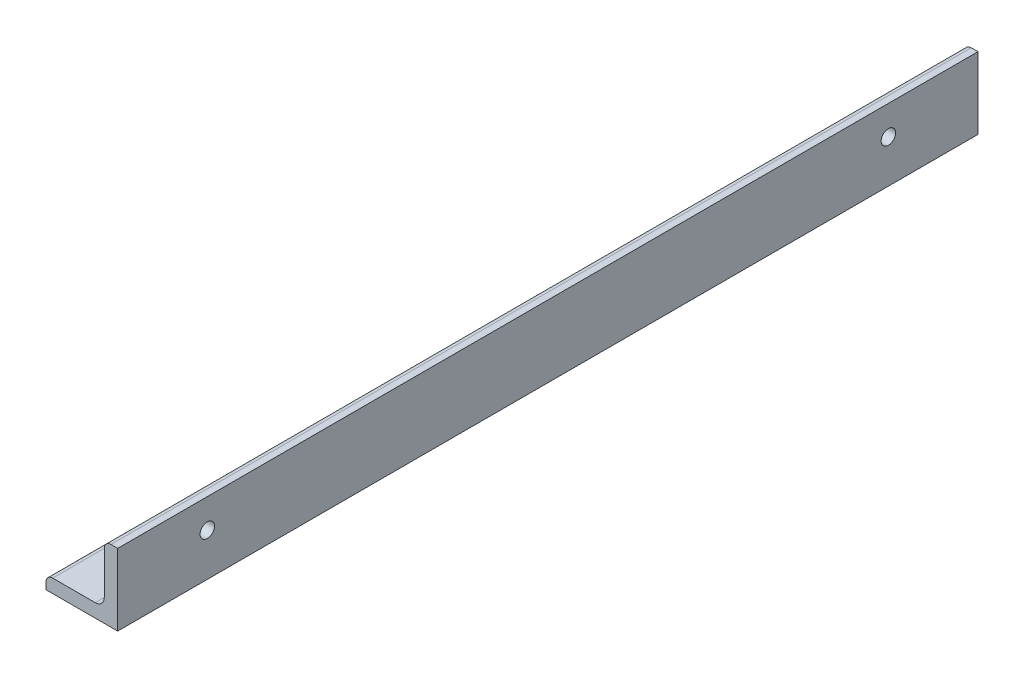
ISO-10303-21;
HEADER;
FILE_DESCRIPTION(('STEP AP214'),'2;1');
FILE_NAME('part.step','',(''),(''),'','','');
FILE_SCHEMA(('AUTOMOTIVE_DESIGN { 1 0 10303 214 1 1 1 1 }'));
ENDSEC;
DATA;
#1=APPLICATION_CONTEXT('core data for automotive mechanical design processes');
#2=APPLICATION_PROTOCOL_DEFINITION('international standard','automotive_design',2000,#1);
#3=PRODUCT_CONTEXT('',#1,'mechanical');
#4=PRODUCT('Part','Part','',(#3));
#5=PRODUCT_RELATED_PRODUCT_CATEGORY('part','',(#4));
#6=PRODUCT_DEFINITION_FORMATION('','',#4);
#7=PRODUCT_DEFINITION_CONTEXT('part definition',#1,'design');
#8=PRODUCT_DEFINITION('design','',#6,#7);
#9=PRODUCT_DEFINITION_SHAPE('','',#8);
#10=(LENGTH_UNIT() NAMED_UNIT(*) SI_UNIT(.MILLI.,.METRE.));
#11=(NAMED_UNIT(*) PLANE_ANGLE_UNIT() SI_UNIT($,.RADIAN.));
#12=(NAMED_UNIT(*) SI_UNIT($,.STERADIAN.) SOLID_ANGLE_UNIT());
#13=UNCERTAINTY_MEASURE_WITH_UNIT(LENGTH_MEASURE(1.E-05),#10,'distance_accuracy_value','');
#14=(GEOMETRIC_REPRESENTATION_CONTEXT(3) GLOBAL_UNCERTAINTY_ASSIGNED_CONTEXT((#13)) GLOBAL_UNIT_ASSIGNED_CONTEXT((#10,
#11,#12)) REPRESENTATION_CONTEXT('',''));
#15=CARTESIAN_POINT('',(0.,0.,0.));
#16=DIRECTION('',(0.,0.,1.));
#17=DIRECTION('',(1.,0.,0.));
#18=AXIS2_PLACEMENT_3D('',#15,#16,#17);
#19=CARTESIAN_POINT('',(-12.7,2.38125,152.4));
#20=DIRECTION('',(1.,0.,0.));
#21=DIRECTION('',(0.,0.,-1.));
#22=AXIS2_PLACEMENT_3D('',#19,#20,#21);
#23=PLANE('',#22);
#24=DIRECTION('',(0.,-1.,0.));
#25=VECTOR('',#24,1.);
#26=CARTESIAN_POINT('',(-12.7,2.38125,-152.4));
#27=LINE('',#26,#25);
#28=CARTESIAN_POINT('',(-12.7,2.38125,-152.4));
#29=VERTEX_POINT('',#28);
#30=CARTESIAN_POINT('',(-12.7,0.,-152.4));
#31=VERTEX_POINT('',#30);
#32=EDGE_CURVE('E148',#29,#31,#27,.T.);
#33=ORIENTED_EDGE('',*,*,#32,.T.);
#34=DIRECTION('',(0.,0.,-1.));
#35=VECTOR('',#34,1.);
#36=CARTESIAN_POINT('',(-12.7,0.,152.4));
#37=LINE('',#36,#35);
#38=CARTESIAN_POINT('',(-12.7,0.,152.4));
#39=VERTEX_POINT('',#38);
#40=EDGE_CURVE('E11',#39,#31,#37,.T.);
#41=ORIENTED_EDGE('',*,*,#40,.F.);
#42=DIRECTION('',(0.,-1.,0.));
#43=VECTOR('',#42,1.);
#44=CARTESIAN_POINT('',(-12.7,2.38125,152.4));
#45=LINE('',#44,#43);
#46=CARTESIAN_POINT('',(-12.7,2.38125,152.4));
#47=VERTEX_POINT('',#46);
#48=EDGE_CURVE('E174',#47,#39,#45,.T.);
#49=ORIENTED_EDGE('',*,*,#48,.F.);
#50=DIRECTION('',(0.,0.,-1.));
#51=VECTOR('',#50,1.);
#52=CARTESIAN_POINT('',(-12.7,2.38125,152.4));
#53=LINE('',#52,#51);
#54=EDGE_CURVE('E144',#47,#29,#53,.T.);
#55=ORIENTED_EDGE('',*,*,#54,.T.);
#56=EDGE_LOOP('',(#33,#41,#49,#55));
#57=FACE_BOUND('',#56,.T.);
#58=ADVANCED_FACE('F39',(#57),#23,.F.);
#59=CARTESIAN_POINT('',(-12.7,0.,152.4));
#60=DIRECTION('',(0.,1.,0.));
#61=DIRECTION('',(0.,0.,1.));
#62=AXIS2_PLACEMENT_3D('',#59,#60,#61);
#63=PLANE('',#62);
#64=CARTESIAN_POINT('',(-2.413,0.,120.65));
#65=DIRECTION('',(0.,-1.,0.));
#66=DIRECTION('',(0.,0.,-1.));
#67=AXIS2_PLACEMENT_3D('',#64,#65,#66);
#68=CIRCLE('',#67,2.55269999999999);
#69=CARTESIAN_POINT('',(-2.413,0.,118.0973));
#70=VERTEX_POINT('',#69);
#71=EDGE_CURVE('E397',#70,#70,#68,.T.);
#72=ORIENTED_EDGE('',*,*,#71,.F.);
#73=EDGE_LOOP('',(#72));
#74=FACE_BOUND('',#73,.T.);
#75=CARTESIAN_POINT('',(-2.413,0.,-120.65));
#76=DIRECTION('',(0.,-1.,0.));
#77=DIRECTION('',(0.,0.,-1.));
#78=AXIS2_PLACEMENT_3D('',#75,#76,#77);
#79=CIRCLE('',#78,2.55269999999999);
#80=CARTESIAN_POINT('',(-2.413,0.,-123.2027));
#81=VERTEX_POINT('',#80);
#82=EDGE_CURVE('E388',#81,#81,#79,.T.);
#83=ORIENTED_EDGE('',*,*,#82,.F.);
#84=EDGE_LOOP('',(#83));
#85=FACE_BOUND('',#84,.T.);
#86=DIRECTION('',(1.,0.,0.));
#87=VECTOR('',#86,1.);
#88=CARTESIAN_POINT('',(-12.7,0.,-152.4));
#89=LINE('',#88,#87);
#90=CARTESIAN_POINT('',(12.7,0.,-152.4));
#91=VERTEX_POINT('',#90);
#92=EDGE_CURVE('E152',#31,#91,#89,.T.);
#93=ORIENTED_EDGE('',*,*,#92,.T.);
#94=DIRECTION('',(0.,0.,-1.));
#95=VECTOR('',#94,1.);
#96=CARTESIAN_POINT('',(12.7,0.,152.4));
#97=LINE('',#96,#95);
#98=CARTESIAN_POINT('',(12.7,0.,152.4));
#99=VERTEX_POINT('',#98);
#100=EDGE_CURVE('E49',#99,#91,#97,.T.);
#101=ORIENTED_EDGE('',*,*,#100,.F.);
#102=DIRECTION('',(1.,0.,0.));
#103=VECTOR('',#102,1.);
#104=CARTESIAN_POINT('',(-12.7,0.,152.4));
#105=LINE('',#104,#103);
#106=EDGE_CURVE('E104',#39,#99,#105,.T.);
#107=ORIENTED_EDGE('',*,*,#106,.F.);
#108=ORIENTED_EDGE('',*,*,#40,.T.);
#109=EDGE_LOOP('',(#93,#101,#107,#108));
#110=FACE_BOUND('',#109,.T.);
#111=ADVANCED_FACE('F254',(#74,#85,#110),#63,.F.);
#112=CARTESIAN_POINT('',(12.7,0.,152.4));
#113=DIRECTION('',(-1.,0.,0.));
#114=DIRECTION('',(0.,0.,1.));
#115=AXIS2_PLACEMENT_3D('',#112,#113,#114);
#116=PLANE('',#115);
#117=CARTESIAN_POINT('',(12.7,15.113,120.65));
#118=DIRECTION('',(1.,0.,0.));
#119=DIRECTION('',(0.,0.,-1.));
#120=AXIS2_PLACEMENT_3D('',#117,#118,#119);
#121=CIRCLE('',#120,2.55269999999999);
#122=CARTESIAN_POINT('',(12.7,15.113,118.0973));
#123=VERTEX_POINT('',#122);
#124=EDGE_CURVE('E208',#123,#123,#121,.T.);
#125=ORIENTED_EDGE('',*,*,#124,.F.);
#126=EDGE_LOOP('',(#125));
#127=FACE_BOUND('',#126,.T.);
#128=CARTESIAN_POINT('',(12.7,15.113,-120.65));
#129=DIRECTION('',(1.,0.,0.));
#130=DIRECTION('',(0.,0.,-1.));
#131=AXIS2_PLACEMENT_3D('',#128,#129,#130);
#132=CIRCLE('',#131,2.55269999999999);
#133=CARTESIAN_POINT('',(12.7,15.113,-123.2027));
#134=VERTEX_POINT('',#133);
#135=EDGE_CURVE('E197',#134,#134,#132,.T.);
#136=ORIENTED_EDGE('',*,*,#135,.F.);
#137=EDGE_LOOP('',(#136));
#138=FACE_BOUND('',#137,.T.);
#139=DIRECTION('',(0.,1.,0.));
#140=VECTOR('',#139,1.);
#141=CARTESIAN_POINT('',(12.7,0.,-152.4));
#142=LINE('',#141,#140);
#143=CARTESIAN_POINT('',(12.7,25.4,-152.4));
#144=VERTEX_POINT('',#143);
#145=EDGE_CURVE('E156',#91,#144,#142,.T.);
#146=ORIENTED_EDGE('',*,*,#145,.T.);
#147=DIRECTION('',(0.,0.,-1.));
#148=VECTOR('',#147,1.);
#149=CARTESIAN_POINT('',(12.7,25.4,152.4));
#150=LINE('',#149,#148);
#151=CARTESIAN_POINT('',(12.7,25.4,152.4));
#152=VERTEX_POINT('',#151);
#153=EDGE_CURVE('E189',#152,#144,#150,.T.);
#154=ORIENTED_EDGE('',*,*,#153,.F.);
#155=DIRECTION('',(0.,1.,0.));
#156=VECTOR('',#155,1.);
#157=CARTESIAN_POINT('',(12.7,0.,152.4));
#158=LINE('',#157,#156);
#159=EDGE_CURVE('E216',#99,#152,#158,.T.);
#160=ORIENTED_EDGE('',*,*,#159,.F.);
#161=ORIENTED_EDGE('',*,*,#100,.T.);
#162=EDGE_LOOP('',(#146,#154,#160,#161));
#163=FACE_BOUND('',#162,.T.);
#164=ADVANCED_FACE('F258',(#127,#138,#163),#116,.F.);
#165=CARTESIAN_POINT('',(10.31875,25.4,152.4));
#166=DIRECTION('',(0.,-1.,0.));
#167=DIRECTION('',(0.,0.,-1.));
#168=AXIS2_PLACEMENT_3D('',#165,#166,#167);
#169=PLANE('',#168);
#170=DIRECTION('',(-1.,0.,0.));
#171=VECTOR('',#170,1.);
#172=CARTESIAN_POINT('',(10.31875,25.4,-152.4));
#173=LINE('',#172,#171);
#174=CARTESIAN_POINT('',(10.31875,25.4,-152.4));
#175=VERTEX_POINT('',#174);
#176=EDGE_CURVE('E159',#144,#175,#173,.T.);
#177=ORIENTED_EDGE('',*,*,#176,.T.);
#178=DIRECTION('',(0.,0.,-1.));
#179=VECTOR('',#178,1.);
#180=CARTESIAN_POINT('',(10.31875,25.4,152.4));
#181=LINE('',#180,#179);
#182=CARTESIAN_POINT('',(10.31875,25.4,152.4));
#183=VERTEX_POINT('',#182);
#184=EDGE_CURVE('E185',#183,#175,#181,.T.);
#185=ORIENTED_EDGE('',*,*,#184,.F.);
#186=DIRECTION('',(-1.,0.,0.));
#187=VECTOR('',#186,1.);
#188=CARTESIAN_POINT('',(10.31875,25.4,152.4));
#189=LINE('',#188,#187);
#190=EDGE_CURVE('E219',#152,#183,#189,.T.);
#191=ORIENTED_EDGE('',*,*,#190,.F.);
#192=ORIENTED_EDGE('',*,*,#153,.T.);
#193=EDGE_LOOP('',(#177,#185,#191,#192));
#194=FACE_BOUND('',#193,.T.);
#195=ADVANCED_FACE('F263',(#194),#169,.F.);
#196=CARTESIAN_POINT('',(10.31875,23.01875,152.4));
#197=DIRECTION('',(0.,0.,-1.));
#198=DIRECTION('',(-1.,0.,0.));
#199=AXIS2_PLACEMENT_3D('',#196,#197,#198);
#200=CYLINDRICAL_SURFACE('',#199,2.38125);
#201=CARTESIAN_POINT('',(10.31875,23.01875,-152.4));
#202=DIRECTION('',(0.,0.,1.));
#203=DIRECTION('',(-1.,0.,0.));
#204=AXIS2_PLACEMENT_3D('',#201,#202,#203);
#205=CIRCLE('',#204,2.38125);
#206=CARTESIAN_POINT('',(7.9375,23.01875,-152.4));
#207=VERTEX_POINT('',#206);
#208=EDGE_CURVE('E162',#175,#207,#205,.T.);
#209=ORIENTED_EDGE('',*,*,#208,.T.);
#210=DIRECTION('',(0.,0.,-1.));
#211=VECTOR('',#210,1.);
#212=CARTESIAN_POINT('',(7.9375,23.01875,152.4));
#213=LINE('',#212,#211);
#214=CARTESIAN_POINT('',(7.9375,23.01875,152.4));
#215=VERTEX_POINT('',#214);
#216=EDGE_CURVE('E181',#215,#207,#213,.T.);
#217=ORIENTED_EDGE('',*,*,#216,.F.);
#218=CARTESIAN_POINT('',(10.31875,23.01875,152.4));
#219=DIRECTION('',(0.,0.,1.));
#220=DIRECTION('',(-1.,0.,0.));
#221=AXIS2_PLACEMENT_3D('',#218,#219,#220);
#222=CIRCLE('',#221,2.38125);
#223=EDGE_CURVE('E222',#183,#215,#222,.T.);
#224=ORIENTED_EDGE('',*,*,#223,.F.);
#225=ORIENTED_EDGE('',*,*,#184,.T.);
#226=EDGE_LOOP('',(#209,#217,#224,#225));
#227=FACE_BOUND('',#226,.T.);
#228=ADVANCED_FACE('F230',(#227),#200,.T.);
#229=CARTESIAN_POINT('',(7.9375,23.01875,152.4));
#230=DIRECTION('',(1.,0.,0.));
#231=DIRECTION('',(0.,0.,-1.));
#232=AXIS2_PLACEMENT_3D('',#229,#230,#231);
#233=PLANE('',#232);
#234=CARTESIAN_POINT('',(7.9375,15.113,120.65));
#235=DIRECTION('',(1.,0.,0.));
#236=DIRECTION('',(0.,0.,-1.));
#237=AXIS2_PLACEMENT_3D('',#234,#235,#236);
#238=CIRCLE('',#237,2.55269999999999);
#239=CARTESIAN_POINT('',(7.9375,15.113,118.0973));
#240=VERTEX_POINT('',#239);
#241=EDGE_CURVE('E202',#240,#240,#238,.T.);
#242=ORIENTED_EDGE('',*,*,#241,.T.);
#243=EDGE_LOOP('',(#242));
#244=FACE_BOUND('',#243,.T.);
#245=CARTESIAN_POINT('',(7.9375,15.113,-120.65));
#246=DIRECTION('',(1.,0.,0.));
#247=DIRECTION('',(0.,0.,-1.));
#248=AXIS2_PLACEMENT_3D('',#245,#246,#247);
#249=CIRCLE('',#248,2.55269999999999);
#250=CARTESIAN_POINT('',(7.9375,15.113,-123.2027));
#251=VERTEX_POINT('',#250);
#252=EDGE_CURVE('E153',#251,#251,#249,.T.);
#253=ORIENTED_EDGE('',*,*,#252,.T.);
#254=EDGE_LOOP('',(#253));
#255=FACE_BOUND('',#254,.T.);
#256=DIRECTION('',(0.,-1.,0.));
#257=VECTOR('',#256,1.);
#258=CARTESIAN_POINT('',(7.9375,23.01875,-152.4));
#259=LINE('',#258,#257);
#260=CARTESIAN_POINT('',(7.9375,7.9375,-152.4));
#261=VERTEX_POINT('',#260);
#262=EDGE_CURVE('E165',#207,#261,#259,.T.);
#263=ORIENTED_EDGE('',*,*,#262,.T.);
#264=DIRECTION('',(0.,0.,-1.));
#265=VECTOR('',#264,1.);
#266=CARTESIAN_POINT('',(7.9375,7.9375,152.4));
#267=LINE('',#266,#265);
#268=CARTESIAN_POINT('',(7.9375,7.9375,152.4));
#269=VERTEX_POINT('',#268);
#270=EDGE_CURVE('E137',#269,#261,#267,.T.);
#271=ORIENTED_EDGE('',*,*,#270,.F.);
#272=DIRECTION('',(0.,-1.,0.));
#273=VECTOR('',#272,1.);
#274=CARTESIAN_POINT('',(7.9375,23.01875,152.4));
#275=LINE('',#274,#273);
#276=EDGE_CURVE('E126',#215,#269,#275,.T.);
#277=ORIENTED_EDGE('',*,*,#276,.F.);
#278=ORIENTED_EDGE('',*,*,#216,.T.);
#279=EDGE_LOOP('',(#263,#271,#277,#278));
#280=FACE_BOUND('',#279,.T.);
#281=ADVANCED_FACE('F234',(#244,#255,#280),#233,.F.);
#282=CARTESIAN_POINT('',(4.7625,7.9375,152.4));
#283=DIRECTION('',(0.,0.,-1.));
#284=DIRECTION('',(-1.,0.,0.));
#285=AXIS2_PLACEMENT_3D('',#282,#283,#284);
#286=CYLINDRICAL_SURFACE('',#285,3.175);
#287=CARTESIAN_POINT('',(4.7625,7.9375,-152.4));
#288=DIRECTION('',(0.,0.,-1.));
#289=DIRECTION('',(-1.,0.,0.));
#290=AXIS2_PLACEMENT_3D('',#287,#288,#289);
#291=CIRCLE('',#290,3.175);
#292=CARTESIAN_POINT('',(4.7625,4.7625,-152.4));
#293=VERTEX_POINT('',#292);
#294=EDGE_CURVE('E135',#261,#293,#291,.T.);
#295=ORIENTED_EDGE('',*,*,#294,.T.);
#296=DIRECTION('',(0.,0.,-1.));
#297=VECTOR('',#296,1.);
#298=CARTESIAN_POINT('',(4.7625,4.7625,152.4));
#299=LINE('',#298,#297);
#300=CARTESIAN_POINT('',(4.7625,4.7625,152.4));
#301=VERTEX_POINT('',#300);
#302=EDGE_CURVE('E132',#301,#293,#299,.T.);
#303=ORIENTED_EDGE('',*,*,#302,.F.);
#304=CARTESIAN_POINT('',(4.7625,7.9375,152.4));
#305=DIRECTION('',(0.,0.,-1.));
#306=DIRECTION('',(-1.,0.,0.));
#307=AXIS2_PLACEMENT_3D('',#304,#305,#306);
#308=CIRCLE('',#307,3.175);
#309=EDGE_CURVE('E120',#269,#301,#308,.T.);
#310=ORIENTED_EDGE('',*,*,#309,.F.);
#311=ORIENTED_EDGE('',*,*,#270,.T.);
#312=EDGE_LOOP('',(#295,#303,#310,#311));
#313=FACE_BOUND('',#312,.T.);
#314=ADVANCED_FACE('F133',(#313),#286,.F.);
#315=CARTESIAN_POINT('',(4.7625,4.7625,152.4));
#316=DIRECTION('',(0.,-1.,0.));
#317=DIRECTION('',(1.,0.,0.));
#318=AXIS2_PLACEMENT_3D('',#315,#316,#317);
#319=PLANE('',#318);
#320=CARTESIAN_POINT('',(-2.413,4.7625,120.65));
#321=DIRECTION('',(0.,-1.,0.));
#322=DIRECTION('',(1.,0.,0.));
#323=AXIS2_PLACEMENT_3D('',#320,#321,#322);
#324=CIRCLE('',#323,2.55269999999999);
#325=CARTESIAN_POINT('',(0.139699999999993,4.7625,120.65));
#326=VERTEX_POINT('',#325);
#327=EDGE_CURVE('E393',#326,#326,#324,.T.);
#328=ORIENTED_EDGE('',*,*,#327,.T.);
#329=EDGE_LOOP('',(#328));
#330=FACE_BOUND('',#329,.T.);
#331=CARTESIAN_POINT('',(-2.413,4.7625,-120.65));
#332=DIRECTION('',(0.,-1.,0.));
#333=DIRECTION('',(1.,0.,0.));
#334=AXIS2_PLACEMENT_3D('',#331,#332,#333);
#335=CIRCLE('',#334,2.55269999999999);
#336=CARTESIAN_POINT('',(0.139699999999993,4.7625,-120.65));
#337=VERTEX_POINT('',#336);
#338=EDGE_CURVE('E42',#337,#337,#335,.T.);
#339=ORIENTED_EDGE('',*,*,#338,.T.);
#340=EDGE_LOOP('',(#339));
#341=FACE_BOUND('',#340,.T.);
#342=DIRECTION('',(-1.,0.,0.));
#343=VECTOR('',#342,1.);
#344=CARTESIAN_POINT('',(4.7625,4.7625,-152.4));
#345=LINE('',#344,#343);
#346=CARTESIAN_POINT('',(-10.31875,4.7625,-152.4));
#347=VERTEX_POINT('',#346);
#348=EDGE_CURVE('E90',#293,#347,#345,.T.);
#349=ORIENTED_EDGE('',*,*,#348,.T.);
#350=DIRECTION('',(0.,0.,-1.));
#351=VECTOR('',#350,1.);
#352=CARTESIAN_POINT('',(-10.31875,4.7625,152.4));
#353=LINE('',#352,#351);
#354=CARTESIAN_POINT('',(-10.31875,4.7625,152.4));
#355=VERTEX_POINT('',#354);
#356=EDGE_CURVE('E138',#355,#347,#353,.T.);
#357=ORIENTED_EDGE('',*,*,#356,.F.);
#358=DIRECTION('',(-1.,0.,0.));
#359=VECTOR('',#358,1.);
#360=CARTESIAN_POINT('',(4.7625,4.7625,152.4));
#361=LINE('',#360,#359);
#362=EDGE_CURVE('E124',#301,#355,#361,.T.);
#363=ORIENTED_EDGE('',*,*,#362,.F.);
#364=ORIENTED_EDGE('',*,*,#302,.T.);
#365=EDGE_LOOP('',(#349,#357,#363,#364));
#366=FACE_BOUND('',#365,.T.);
#367=ADVANCED_FACE('F140',(#330,#341,#366),#319,.F.);
#368=CARTESIAN_POINT('',(-10.31875,2.38125,152.4));
#369=DIRECTION('',(0.,0.,-1.));
#370=DIRECTION('',(-1.,0.,0.));
#371=AXIS2_PLACEMENT_3D('',#368,#369,#370);
#372=CYLINDRICAL_SURFACE('',#371,2.38125);
#373=CARTESIAN_POINT('',(-10.31875,2.38125,-152.4));
#374=DIRECTION('',(0.,0.,1.));
#375=DIRECTION('',(-1.,0.,0.));
#376=AXIS2_PLACEMENT_3D('',#373,#374,#375);
#377=CIRCLE('',#376,2.38125);
#378=EDGE_CURVE('E96',#347,#29,#377,.T.);
#379=ORIENTED_EDGE('',*,*,#378,.T.);
#380=ORIENTED_EDGE('',*,*,#54,.F.);
#381=CARTESIAN_POINT('',(-10.31875,2.38125,152.4));
#382=DIRECTION('',(0.,0.,1.));
#383=DIRECTION('',(-1.,0.,0.));
#384=AXIS2_PLACEMENT_3D('',#381,#382,#383);
#385=CIRCLE('',#384,2.38125);
#386=EDGE_CURVE('E58',#355,#47,#385,.T.);
#387=ORIENTED_EDGE('',*,*,#386,.F.);
#388=ORIENTED_EDGE('',*,*,#356,.T.);
#389=EDGE_LOOP('',(#379,#380,#387,#388));
#390=FACE_BOUND('',#389,.T.);
#391=ADVANCED_FACE('F242',(#390),#372,.T.);
#392=CARTESIAN_POINT('',(10.31875,23.01875,152.4));
#393=DIRECTION('',(0.,0.,-1.));
#394=DIRECTION('',(-1.,0.,0.));
#395=AXIS2_PLACEMENT_3D('',#392,#393,#394);
#396=PLANE('',#395);
#397=ORIENTED_EDGE('',*,*,#48,.T.);
#398=ORIENTED_EDGE('',*,*,#106,.T.);
#399=ORIENTED_EDGE('',*,*,#159,.T.);
#400=ORIENTED_EDGE('',*,*,#190,.T.);
#401=ORIENTED_EDGE('',*,*,#223,.T.);
#402=ORIENTED_EDGE('',*,*,#276,.T.);
#403=ORIENTED_EDGE('',*,*,#309,.T.);
#404=ORIENTED_EDGE('',*,*,#362,.T.);
#405=ORIENTED_EDGE('',*,*,#386,.T.);
#406=EDGE_LOOP('',(#397,#398,#399,#400,#401,#402,#403,#404,#405));
#407=FACE_BOUND('',#406,.T.);
#408=ADVANCED_FACE('F122',(#407),#396,.F.);
#409=CARTESIAN_POINT('',(10.31875,23.01875,-152.4));
#410=DIRECTION('',(0.,0.,-1.));
#411=DIRECTION('',(-1.,0.,0.));
#412=AXIS2_PLACEMENT_3D('',#409,#410,#411);
#413=PLANE('',#412);
#414=ORIENTED_EDGE('',*,*,#32,.F.);
#415=ORIENTED_EDGE('',*,*,#378,.F.);
#416=ORIENTED_EDGE('',*,*,#348,.F.);
#417=ORIENTED_EDGE('',*,*,#294,.F.);
#418=ORIENTED_EDGE('',*,*,#262,.F.);
#419=ORIENTED_EDGE('',*,*,#208,.F.);
#420=ORIENTED_EDGE('',*,*,#176,.F.);
#421=ORIENTED_EDGE('',*,*,#145,.F.);
#422=ORIENTED_EDGE('',*,*,#92,.F.);
#423=EDGE_LOOP('',(#414,#415,#416,#417,#418,#419,#420,#421,#422));
#424=FACE_BOUND('',#423,.T.);
#425=ADVANCED_FACE('F237',(#424),#413,.T.);
#426=CARTESIAN_POINT('',(12.7,15.113,-120.65));
#427=DIRECTION('',(1.,0.,0.));
#428=DIRECTION('',(0.,0.,-1.));
#429=AXIS2_PLACEMENT_3D('',#426,#427,#428);
#430=CYLINDRICAL_SURFACE('',#429,2.55269999999999);
#431=ORIENTED_EDGE('',*,*,#135,.T.);
#432=EDGE_LOOP('',(#431));
#433=FACE_BOUND('',#432,.T.);
#434=ORIENTED_EDGE('',*,*,#252,.F.);
#435=EDGE_LOOP('',(#434));
#436=FACE_BOUND('',#435,.T.);
#437=ADVANCED_FACE('F322',(#433,#436),#430,.F.);
#438=CARTESIAN_POINT('',(12.7,15.113,120.65));
#439=DIRECTION('',(1.,0.,0.));
#440=DIRECTION('',(0.,0.,-1.));
#441=AXIS2_PLACEMENT_3D('',#438,#439,#440);
#442=CYLINDRICAL_SURFACE('',#441,2.55269999999999);
#443=ORIENTED_EDGE('',*,*,#124,.T.);
#444=EDGE_LOOP('',(#443));
#445=FACE_BOUND('',#444,.T.);
#446=ORIENTED_EDGE('',*,*,#241,.F.);
#447=EDGE_LOOP('',(#446));
#448=FACE_BOUND('',#447,.T.);
#449=ADVANCED_FACE('F302',(#445,#448),#442,.F.);
#450=CARTESIAN_POINT('',(-2.413,0.,-120.65));
#451=DIRECTION('',(0.,-1.,0.));
#452=DIRECTION('',(0.,0.,-1.));
#453=AXIS2_PLACEMENT_3D('',#450,#451,#452);
#454=CYLINDRICAL_SURFACE('',#453,2.55269999999999);
#455=ORIENTED_EDGE('',*,*,#82,.T.);
#456=EDGE_LOOP('',(#455));
#457=FACE_BOUND('',#456,.T.);
#458=ORIENTED_EDGE('',*,*,#338,.F.);
#459=EDGE_LOOP('',(#458));
#460=FACE_BOUND('',#459,.T.);
#461=ADVANCED_FACE('F296',(#457,#460),#454,.F.);
#462=CARTESIAN_POINT('',(-2.413,0.,120.65));
#463=DIRECTION('',(0.,-1.,0.));
#464=DIRECTION('',(0.,0.,-1.));
#465=AXIS2_PLACEMENT_3D('',#462,#463,#464);
#466=CYLINDRICAL_SURFACE('',#465,2.55269999999999);
#467=ORIENTED_EDGE('',*,*,#71,.T.);
#468=EDGE_LOOP('',(#467));
#469=FACE_BOUND('',#468,.T.);
#470=ORIENTED_EDGE('',*,*,#327,.F.);
#471=EDGE_LOOP('',(#470));
#472=FACE_BOUND('',#471,.T.);
#473=ADVANCED_FACE('F301',(#469,#472),#466,.F.);
#474=CLOSED_SHELL('',(#58,#111,#164,#195,#228,#281,#314,#367,#391,#408,#425,#437,#449,#461,#473));
#475=MANIFOLD_SOLID_BREP('B2',#474);
#476=ADVANCED_BREP_SHAPE_REPRESENTATION('',(#18,#475),#14);
#477=SHAPE_DEFINITION_REPRESENTATION(#9,#476);
ENDSEC;
END-ISO-10303-21;
